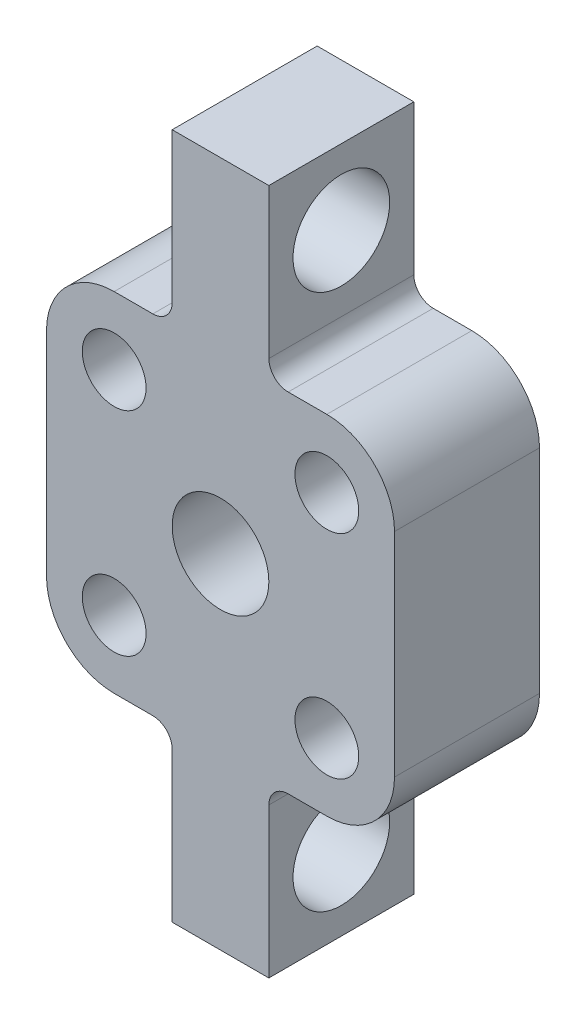
ISO-10303-21;
HEADER;
FILE_DESCRIPTION(('STEP AP214'),'2;1');
FILE_NAME('part.step','',(''),(''),'','','');
FILE_SCHEMA(('AUTOMOTIVE_DESIGN { 1 0 10303 214 1 1 1 1 }'));
ENDSEC;
DATA;
#1=APPLICATION_CONTEXT('core data for automotive mechanical design processes');
#2=APPLICATION_PROTOCOL_DEFINITION('international standard','automotive_design',2000,#1);
#3=PRODUCT_CONTEXT('',#1,'mechanical');
#4=PRODUCT('Part','Part','',(#3));
#5=PRODUCT_RELATED_PRODUCT_CATEGORY('part','',(#4));
#6=PRODUCT_DEFINITION_FORMATION('','',#4);
#7=PRODUCT_DEFINITION_CONTEXT('part definition',#1,'design');
#8=PRODUCT_DEFINITION('design','',#6,#7);
#9=PRODUCT_DEFINITION_SHAPE('','',#8);
#10=(LENGTH_UNIT() NAMED_UNIT(*) SI_UNIT(.MILLI.,.METRE.));
#11=(NAMED_UNIT(*) PLANE_ANGLE_UNIT() SI_UNIT($,.RADIAN.));
#12=(NAMED_UNIT(*) SI_UNIT($,.STERADIAN.) SOLID_ANGLE_UNIT());
#13=UNCERTAINTY_MEASURE_WITH_UNIT(LENGTH_MEASURE(1.E-05),#10,'distance_accuracy_value','');
#14=(GEOMETRIC_REPRESENTATION_CONTEXT(3) GLOBAL_UNCERTAINTY_ASSIGNED_CONTEXT((#13)) GLOBAL_UNIT_ASSIGNED_CONTEXT((#10,
#11,#12)) REPRESENTATION_CONTEXT('',''));
#15=CARTESIAN_POINT('',(0.,0.,0.));
#16=DIRECTION('',(0.,0.,1.));
#17=DIRECTION('',(1.,0.,0.));
#18=AXIS2_PLACEMENT_3D('',#15,#16,#17);
#19=CARTESIAN_POINT('',(6.99999999999999,-20.,15.));
#20=DIRECTION('',(0.,0.,1.));
#21=DIRECTION('',(1.,0.,0.));
#22=AXIS2_PLACEMENT_3D('',#19,#20,#21);
#23=PLANE('',#22);
#24=CARTESIAN_POINT('',(11.,11.,15.));
#25=DIRECTION('',(0.,0.,1.));
#26=DIRECTION('',(1.,0.,0.));
#27=AXIS2_PLACEMENT_3D('',#24,#25,#26);
#28=CIRCLE('',#27,3.29999999999999);
#29=CARTESIAN_POINT('',(14.3,11.,15.));
#30=VERTEX_POINT('',#29);
#31=EDGE_CURVE('E309',#30,#30,#28,.T.);
#32=ORIENTED_EDGE('',*,*,#31,.F.);
#33=EDGE_LOOP('',(#32));
#34=FACE_BOUND('',#33,.T.);
#35=CARTESIAN_POINT('',(-11.,11.,15.));
#36=DIRECTION('',(0.,0.,1.));
#37=DIRECTION('',(1.,0.,0.));
#38=AXIS2_PLACEMENT_3D('',#35,#36,#37);
#39=CIRCLE('',#38,3.29999999999999);
#40=CARTESIAN_POINT('',(-7.70000000000001,11.,15.));
#41=VERTEX_POINT('',#40);
#42=EDGE_CURVE('E316',#41,#41,#39,.T.);
#43=ORIENTED_EDGE('',*,*,#42,.F.);
#44=EDGE_LOOP('',(#43));
#45=FACE_BOUND('',#44,.T.);
#46=CARTESIAN_POINT('',(-11.,-11.,15.));
#47=DIRECTION('',(0.,0.,1.));
#48=DIRECTION('',(1.,0.,0.));
#49=AXIS2_PLACEMENT_3D('',#46,#47,#48);
#50=CIRCLE('',#49,3.29999999999999);
#51=CARTESIAN_POINT('',(-7.70000000000001,-11.,15.));
#52=VERTEX_POINT('',#51);
#53=EDGE_CURVE('E325',#52,#52,#50,.T.);
#54=ORIENTED_EDGE('',*,*,#53,.F.);
#55=EDGE_LOOP('',(#54));
#56=FACE_BOUND('',#55,.T.);
#57=CARTESIAN_POINT('',(11.,-11.,15.));
#58=DIRECTION('',(0.,0.,1.));
#59=DIRECTION('',(1.,0.,0.));
#60=AXIS2_PLACEMENT_3D('',#57,#58,#59);
#61=CIRCLE('',#60,3.29999999999999);
#62=CARTESIAN_POINT('',(14.3,-11.,15.));
#63=VERTEX_POINT('',#62);
#64=EDGE_CURVE('E327',#63,#63,#61,.T.);
#65=ORIENTED_EDGE('',*,*,#64,.F.);
#66=EDGE_LOOP('',(#65));
#67=FACE_BOUND('',#66,.T.);
#68=DIRECTION('',(0.,1.,0.));
#69=VECTOR('',#68,1.);
#70=CARTESIAN_POINT('',(5.00000000000001,-35.5,15.));
#71=LINE('',#70,#69);
#72=CARTESIAN_POINT('',(5.00000000000001,-35.5,15.));
#73=VERTEX_POINT('',#72);
#74=CARTESIAN_POINT('',(4.99999999999999,-20.,15.));
#75=VERTEX_POINT('',#74);
#76=EDGE_CURVE('E246',#73,#75,#71,.T.);
#77=ORIENTED_EDGE('',*,*,#76,.T.);
#78=CARTESIAN_POINT('',(6.99999999999999,-20.,15.));
#79=DIRECTION('',(0.,0.,-1.));
#80=DIRECTION('',(1.,0.,0.));
#81=AXIS2_PLACEMENT_3D('',#78,#79,#80);
#82=CIRCLE('',#81,2.);
#83=CARTESIAN_POINT('',(7.,-18.,15.));
#84=VERTEX_POINT('',#83);
#85=EDGE_CURVE('E139',#75,#84,#82,.T.);
#86=ORIENTED_EDGE('',*,*,#85,.T.);
#87=DIRECTION('',(1.,0.,0.));
#88=VECTOR('',#87,1.);
#89=CARTESIAN_POINT('',(7.,-18.,15.));
#90=LINE('',#89,#88);
#91=CARTESIAN_POINT('',(11.,-18.,15.));
#92=VERTEX_POINT('',#91);
#93=EDGE_CURVE('E342',#84,#92,#90,.T.);
#94=ORIENTED_EDGE('',*,*,#93,.T.);
#95=CARTESIAN_POINT('',(11.,-11.,15.));
#96=DIRECTION('',(0.,0.,1.));
#97=DIRECTION('',(1.,0.,0.));
#98=AXIS2_PLACEMENT_3D('',#95,#96,#97);
#99=CIRCLE('',#98,7.);
#100=CARTESIAN_POINT('',(18.,-11.,15.));
#101=VERTEX_POINT('',#100);
#102=EDGE_CURVE('E345',#92,#101,#99,.T.);
#103=ORIENTED_EDGE('',*,*,#102,.T.);
#104=DIRECTION('',(0.,1.,0.));
#105=VECTOR('',#104,1.);
#106=CARTESIAN_POINT('',(18.,11.,15.));
#107=LINE('',#106,#105);
#108=CARTESIAN_POINT('',(18.,11.,15.));
#109=VERTEX_POINT('',#108);
#110=EDGE_CURVE('E343',#101,#109,#107,.T.);
#111=ORIENTED_EDGE('',*,*,#110,.T.);
#112=CARTESIAN_POINT('',(11.,11.,15.));
#113=DIRECTION('',(0.,0.,1.));
#114=DIRECTION('',(-1.,0.,0.));
#115=AXIS2_PLACEMENT_3D('',#112,#113,#114);
#116=CIRCLE('',#115,7.);
#117=CARTESIAN_POINT('',(11.,18.,15.));
#118=VERTEX_POINT('',#117);
#119=EDGE_CURVE('E350',#109,#118,#116,.T.);
#120=ORIENTED_EDGE('',*,*,#119,.T.);
#121=DIRECTION('',(-1.,0.,0.));
#122=VECTOR('',#121,1.);
#123=CARTESIAN_POINT('',(7.,18.,15.));
#124=LINE('',#123,#122);
#125=CARTESIAN_POINT('',(7.,18.,15.));
#126=VERTEX_POINT('',#125);
#127=EDGE_CURVE('E349',#118,#126,#124,.T.);
#128=ORIENTED_EDGE('',*,*,#127,.T.);
#129=CARTESIAN_POINT('',(6.99999999999999,20.,15.));
#130=DIRECTION('',(0.,0.,-1.));
#131=DIRECTION('',(-1.,0.,0.));
#132=AXIS2_PLACEMENT_3D('',#129,#130,#131);
#133=CIRCLE('',#132,2.);
#134=CARTESIAN_POINT('',(4.99999999999999,20.,15.));
#135=VERTEX_POINT('',#134);
#136=EDGE_CURVE('E351',#126,#135,#133,.T.);
#137=ORIENTED_EDGE('',*,*,#136,.T.);
#138=DIRECTION('',(0.,1.,0.));
#139=VECTOR('',#138,1.);
#140=CARTESIAN_POINT('',(5.00000000000001,35.5,15.));
#141=LINE('',#140,#139);
#142=CARTESIAN_POINT('',(5.00000000000001,35.5,15.));
#143=VERTEX_POINT('',#142);
#144=EDGE_CURVE('E352',#135,#143,#141,.T.);
#145=ORIENTED_EDGE('',*,*,#144,.T.);
#146=DIRECTION('',(-1.,0.,0.));
#147=VECTOR('',#146,1.);
#148=CARTESIAN_POINT('',(-5.00000000000001,35.5,15.));
#149=LINE('',#148,#147);
#150=CARTESIAN_POINT('',(-5.00000000000001,35.5,15.));
#151=VERTEX_POINT('',#150);
#152=EDGE_CURVE('E354',#143,#151,#149,.T.);
#153=ORIENTED_EDGE('',*,*,#152,.T.);
#154=DIRECTION('',(0.,-1.,0.));
#155=VECTOR('',#154,1.);
#156=CARTESIAN_POINT('',(-4.99999999999999,20.,15.));
#157=LINE('',#156,#155);
#158=CARTESIAN_POINT('',(-4.99999999999999,20.,15.));
#159=VERTEX_POINT('',#158);
#160=EDGE_CURVE('E359',#151,#159,#157,.T.);
#161=ORIENTED_EDGE('',*,*,#160,.T.);
#162=CARTESIAN_POINT('',(-6.99999999999999,20.,15.));
#163=DIRECTION('',(0.,0.,-1.));
#164=DIRECTION('',(1.,0.,0.));
#165=AXIS2_PLACEMENT_3D('',#162,#163,#164);
#166=CIRCLE('',#165,2.);
#167=CARTESIAN_POINT('',(-7.,18.,15.));
#168=VERTEX_POINT('',#167);
#169=EDGE_CURVE('E356',#159,#168,#166,.T.);
#170=ORIENTED_EDGE('',*,*,#169,.T.);
#171=DIRECTION('',(-1.,0.,0.));
#172=VECTOR('',#171,1.);
#173=CARTESIAN_POINT('',(-11.,18.,15.));
#174=LINE('',#173,#172);
#175=CARTESIAN_POINT('',(-11.,18.,15.));
#176=VERTEX_POINT('',#175);
#177=EDGE_CURVE('E363',#168,#176,#174,.T.);
#178=ORIENTED_EDGE('',*,*,#177,.T.);
#179=CARTESIAN_POINT('',(-11.,11.,15.));
#180=DIRECTION('',(0.,0.,1.));
#181=DIRECTION('',(1.,0.,0.));
#182=AXIS2_PLACEMENT_3D('',#179,#180,#181);
#183=CIRCLE('',#182,7.);
#184=CARTESIAN_POINT('',(-18.,11.,15.));
#185=VERTEX_POINT('',#184);
#186=EDGE_CURVE('E361',#176,#185,#183,.T.);
#187=ORIENTED_EDGE('',*,*,#186,.T.);
#188=DIRECTION('',(0.,-1.,0.));
#189=VECTOR('',#188,1.);
#190=CARTESIAN_POINT('',(-18.,11.,15.));
#191=LINE('',#190,#189);
#192=CARTESIAN_POINT('',(-18.,-11.,15.));
#193=VERTEX_POINT('',#192);
#194=EDGE_CURVE('E364',#185,#193,#191,.T.);
#195=ORIENTED_EDGE('',*,*,#194,.T.);
#196=CARTESIAN_POINT('',(-11.,-11.,15.));
#197=DIRECTION('',(0.,0.,1.));
#198=DIRECTION('',(-1.,0.,0.));
#199=AXIS2_PLACEMENT_3D('',#196,#197,#198);
#200=CIRCLE('',#199,7.);
#201=CARTESIAN_POINT('',(-11.,-18.,15.));
#202=VERTEX_POINT('',#201);
#203=EDGE_CURVE('E370',#193,#202,#200,.T.);
#204=ORIENTED_EDGE('',*,*,#203,.T.);
#205=DIRECTION('',(1.,0.,0.));
#206=VECTOR('',#205,1.);
#207=CARTESIAN_POINT('',(-11.,-18.,15.));
#208=LINE('',#207,#206);
#209=CARTESIAN_POINT('',(-7.,-18.,15.));
#210=VERTEX_POINT('',#209);
#211=EDGE_CURVE('E194',#202,#210,#208,.T.);
#212=ORIENTED_EDGE('',*,*,#211,.T.);
#213=CARTESIAN_POINT('',(-6.99999999999999,-20.,15.));
#214=DIRECTION('',(0.,0.,-1.));
#215=DIRECTION('',(-1.,0.,0.));
#216=AXIS2_PLACEMENT_3D('',#213,#214,#215);
#217=CIRCLE('',#216,2.);
#218=CARTESIAN_POINT('',(-4.99999999999999,-20.,15.));
#219=VERTEX_POINT('',#218);
#220=EDGE_CURVE('E186',#210,#219,#217,.T.);
#221=ORIENTED_EDGE('',*,*,#220,.T.);
#222=DIRECTION('',(0.,-1.,0.));
#223=VECTOR('',#222,1.);
#224=CARTESIAN_POINT('',(-4.99999999999999,-20.,15.));
#225=LINE('',#224,#223);
#226=CARTESIAN_POINT('',(-4.99999999999999,-35.5,15.));
#227=VERTEX_POINT('',#226);
#228=EDGE_CURVE('E189',#219,#227,#225,.T.);
#229=ORIENTED_EDGE('',*,*,#228,.T.);
#230=DIRECTION('',(1.,0.,0.));
#231=VECTOR('',#230,1.);
#232=CARTESIAN_POINT('',(-4.99999999999999,-35.5,15.));
#233=LINE('',#232,#231);
#234=EDGE_CURVE('E59',#227,#73,#233,.T.);
#235=ORIENTED_EDGE('',*,*,#234,.T.);
#236=EDGE_LOOP('',(#77,#86,#94,#103,#111,#120,#128,#137,#145,#153,#161,#170,#178,#187,#195,#204,
#212,#221,#229,#235));
#237=FACE_BOUND('',#236,.T.);
#238=CARTESIAN_POINT('',(0.,0.,15.));
#239=DIRECTION('',(0.,0.,1.));
#240=DIRECTION('',(1.,0.,0.));
#241=AXIS2_PLACEMENT_3D('',#238,#239,#240);
#242=CIRCLE('',#241,5.);
#243=CARTESIAN_POINT('',(5.,0.,15.));
#244=VERTEX_POINT('',#243);
#245=EDGE_CURVE('E212',#244,#244,#242,.T.);
#246=ORIENTED_EDGE('',*,*,#245,.F.);
#247=EDGE_LOOP('',(#246));
#248=FACE_BOUND('',#247,.T.);
#249=ADVANCED_FACE('F39',(#34,#45,#56,#67,#237,#248),#23,.T.);
#250=CARTESIAN_POINT('',(6.99999999999999,-20.,0.));
#251=DIRECTION('',(0.,0.,1.));
#252=DIRECTION('',(1.,0.,0.));
#253=AXIS2_PLACEMENT_3D('',#250,#251,#252);
#254=PLANE('',#253);
#255=CARTESIAN_POINT('',(11.,11.,0.));
#256=DIRECTION('',(0.,0.,1.));
#257=DIRECTION('',(1.,0.,0.));
#258=AXIS2_PLACEMENT_3D('',#255,#256,#257);
#259=CIRCLE('',#258,3.3);
#260=CARTESIAN_POINT('',(14.3,11.,0.));
#261=VERTEX_POINT('',#260);
#262=EDGE_CURVE('E311',#261,#261,#259,.T.);
#263=ORIENTED_EDGE('',*,*,#262,.T.);
#264=EDGE_LOOP('',(#263));
#265=FACE_BOUND('',#264,.T.);
#266=CARTESIAN_POINT('',(-11.,11.,0.));
#267=DIRECTION('',(0.,0.,1.));
#268=DIRECTION('',(1.,0.,0.));
#269=AXIS2_PLACEMENT_3D('',#266,#267,#268);
#270=CIRCLE('',#269,3.3);
#271=CARTESIAN_POINT('',(-7.7,11.,0.));
#272=VERTEX_POINT('',#271);
#273=EDGE_CURVE('E317',#272,#272,#270,.T.);
#274=ORIENTED_EDGE('',*,*,#273,.T.);
#275=EDGE_LOOP('',(#274));
#276=FACE_BOUND('',#275,.T.);
#277=CARTESIAN_POINT('',(-11.,-11.,0.));
#278=DIRECTION('',(0.,0.,1.));
#279=DIRECTION('',(1.,0.,0.));
#280=AXIS2_PLACEMENT_3D('',#277,#278,#279);
#281=CIRCLE('',#280,3.3);
#282=CARTESIAN_POINT('',(-7.7,-11.,0.));
#283=VERTEX_POINT('',#282);
#284=EDGE_CURVE('E324',#283,#283,#281,.T.);
#285=ORIENTED_EDGE('',*,*,#284,.T.);
#286=EDGE_LOOP('',(#285));
#287=FACE_BOUND('',#286,.T.);
#288=CARTESIAN_POINT('',(11.,-11.,0.));
#289=DIRECTION('',(0.,0.,1.));
#290=DIRECTION('',(1.,0.,0.));
#291=AXIS2_PLACEMENT_3D('',#288,#289,#290);
#292=CIRCLE('',#291,3.3);
#293=CARTESIAN_POINT('',(14.3,-11.,0.));
#294=VERTEX_POINT('',#293);
#295=EDGE_CURVE('E332',#294,#294,#292,.T.);
#296=ORIENTED_EDGE('',*,*,#295,.T.);
#297=EDGE_LOOP('',(#296));
#298=FACE_BOUND('',#297,.T.);
#299=DIRECTION('',(0.,1.,0.));
#300=VECTOR('',#299,1.);
#301=CARTESIAN_POINT('',(5.00000000000001,-35.5,0.));
#302=LINE('',#301,#300);
#303=CARTESIAN_POINT('',(5.00000000000001,-35.5,0.));
#304=VERTEX_POINT('',#303);
#305=CARTESIAN_POINT('',(4.99999999999999,-20.,0.));
#306=VERTEX_POINT('',#305);
#307=EDGE_CURVE('E209',#304,#306,#302,.T.);
#308=ORIENTED_EDGE('',*,*,#307,.F.);
#309=DIRECTION('',(1.,0.,0.));
#310=VECTOR('',#309,1.);
#311=CARTESIAN_POINT('',(-4.99999999999999,-35.5,0.));
#312=LINE('',#311,#310);
#313=CARTESIAN_POINT('',(-4.99999999999999,-35.5,0.));
#314=VERTEX_POINT('',#313);
#315=EDGE_CURVE('E129',#314,#304,#312,.T.);
#316=ORIENTED_EDGE('',*,*,#315,.F.);
#317=DIRECTION('',(0.,-1.,0.));
#318=VECTOR('',#317,1.);
#319=CARTESIAN_POINT('',(-4.99999999999999,-20.,0.));
#320=LINE('',#319,#318);
#321=CARTESIAN_POINT('',(-4.99999999999999,-20.,0.));
#322=VERTEX_POINT('',#321);
#323=EDGE_CURVE('E125',#322,#314,#320,.T.);
#324=ORIENTED_EDGE('',*,*,#323,.F.);
#325=CARTESIAN_POINT('',(-6.99999999999999,-20.,0.));
#326=DIRECTION('',(0.,0.,-1.));
#327=DIRECTION('',(-1.,0.,0.));
#328=AXIS2_PLACEMENT_3D('',#325,#326,#327);
#329=CIRCLE('',#328,2.);
#330=CARTESIAN_POINT('',(-7.,-18.,0.));
#331=VERTEX_POINT('',#330);
#332=EDGE_CURVE('E199',#331,#322,#329,.T.);
#333=ORIENTED_EDGE('',*,*,#332,.F.);
#334=DIRECTION('',(1.,0.,0.));
#335=VECTOR('',#334,1.);
#336=CARTESIAN_POINT('',(-11.,-18.,0.));
#337=LINE('',#336,#335);
#338=CARTESIAN_POINT('',(-11.,-18.,0.));
#339=VERTEX_POINT('',#338);
#340=EDGE_CURVE('E243',#339,#331,#337,.T.);
#341=ORIENTED_EDGE('',*,*,#340,.F.);
#342=CARTESIAN_POINT('',(-11.,-11.,0.));
#343=DIRECTION('',(0.,0.,1.));
#344=DIRECTION('',(-1.,0.,0.));
#345=AXIS2_PLACEMENT_3D('',#342,#343,#344);
#346=CIRCLE('',#345,7.);
#347=CARTESIAN_POINT('',(-18.,-11.,0.));
#348=VERTEX_POINT('',#347);
#349=EDGE_CURVE('E245',#348,#339,#346,.T.);
#350=ORIENTED_EDGE('',*,*,#349,.F.);
#351=DIRECTION('',(0.,-1.,0.));
#352=VECTOR('',#351,1.);
#353=CARTESIAN_POINT('',(-18.,11.,0.));
#354=LINE('',#353,#352);
#355=CARTESIAN_POINT('',(-18.,11.,0.));
#356=VERTEX_POINT('',#355);
#357=EDGE_CURVE('E238',#356,#348,#354,.T.);
#358=ORIENTED_EDGE('',*,*,#357,.F.);
#359=CARTESIAN_POINT('',(-11.,11.,0.));
#360=DIRECTION('',(0.,0.,1.));
#361=DIRECTION('',(1.,0.,0.));
#362=AXIS2_PLACEMENT_3D('',#359,#360,#361);
#363=CIRCLE('',#362,7.);
#364=CARTESIAN_POINT('',(-11.,18.,0.));
#365=VERTEX_POINT('',#364);
#366=EDGE_CURVE('E236',#365,#356,#363,.T.);
#367=ORIENTED_EDGE('',*,*,#366,.F.);
#368=DIRECTION('',(-1.,0.,0.));
#369=VECTOR('',#368,1.);
#370=CARTESIAN_POINT('',(-11.,18.,0.));
#371=LINE('',#370,#369);
#372=CARTESIAN_POINT('',(-7.,18.,0.));
#373=VERTEX_POINT('',#372);
#374=EDGE_CURVE('E237',#373,#365,#371,.T.);
#375=ORIENTED_EDGE('',*,*,#374,.F.);
#376=CARTESIAN_POINT('',(-6.99999999999999,20.,0.));
#377=DIRECTION('',(0.,0.,-1.));
#378=DIRECTION('',(1.,0.,0.));
#379=AXIS2_PLACEMENT_3D('',#376,#377,#378);
#380=CIRCLE('',#379,2.);
#381=CARTESIAN_POINT('',(-4.99999999999999,20.,0.));
#382=VERTEX_POINT('',#381);
#383=EDGE_CURVE('E231',#382,#373,#380,.T.);
#384=ORIENTED_EDGE('',*,*,#383,.F.);
#385=DIRECTION('',(0.,-1.,0.));
#386=VECTOR('',#385,1.);
#387=CARTESIAN_POINT('',(-4.99999999999999,20.,0.));
#388=LINE('',#387,#386);
#389=CARTESIAN_POINT('',(-5.00000000000001,35.5,0.));
#390=VERTEX_POINT('',#389);
#391=EDGE_CURVE('E234',#390,#382,#388,.T.);
#392=ORIENTED_EDGE('',*,*,#391,.F.);
#393=DIRECTION('',(-1.,0.,0.));
#394=VECTOR('',#393,1.);
#395=CARTESIAN_POINT('',(-5.00000000000001,35.5,0.));
#396=LINE('',#395,#394);
#397=CARTESIAN_POINT('',(5.00000000000001,35.5,0.));
#398=VERTEX_POINT('',#397);
#399=EDGE_CURVE('E229',#398,#390,#396,.T.);
#400=ORIENTED_EDGE('',*,*,#399,.F.);
#401=DIRECTION('',(0.,1.,0.));
#402=VECTOR('',#401,1.);
#403=CARTESIAN_POINT('',(5.00000000000001,35.5,0.));
#404=LINE('',#403,#402);
#405=CARTESIAN_POINT('',(4.99999999999999,20.,0.));
#406=VERTEX_POINT('',#405);
#407=EDGE_CURVE('E227',#406,#398,#404,.T.);
#408=ORIENTED_EDGE('',*,*,#407,.F.);
#409=CARTESIAN_POINT('',(6.99999999999999,20.,0.));
#410=DIRECTION('',(0.,0.,-1.));
#411=DIRECTION('',(-1.,0.,0.));
#412=AXIS2_PLACEMENT_3D('',#409,#410,#411);
#413=CIRCLE('',#412,2.);
#414=CARTESIAN_POINT('',(7.,18.,0.));
#415=VERTEX_POINT('',#414);
#416=EDGE_CURVE('E226',#415,#406,#413,.T.);
#417=ORIENTED_EDGE('',*,*,#416,.F.);
#418=DIRECTION('',(-1.,0.,0.));
#419=VECTOR('',#418,1.);
#420=CARTESIAN_POINT('',(7.,18.,0.));
#421=LINE('',#420,#419);
#422=CARTESIAN_POINT('',(11.,18.,0.));
#423=VERTEX_POINT('',#422);
#424=EDGE_CURVE('E221',#423,#415,#421,.T.);
#425=ORIENTED_EDGE('',*,*,#424,.F.);
#426=CARTESIAN_POINT('',(11.,11.,0.));
#427=DIRECTION('',(0.,0.,1.));
#428=DIRECTION('',(-1.,0.,0.));
#429=AXIS2_PLACEMENT_3D('',#426,#427,#428);
#430=CIRCLE('',#429,7.);
#431=CARTESIAN_POINT('',(18.,11.,0.));
#432=VERTEX_POINT('',#431);
#433=EDGE_CURVE('E225',#432,#423,#430,.T.);
#434=ORIENTED_EDGE('',*,*,#433,.F.);
#435=DIRECTION('',(0.,1.,0.));
#436=VECTOR('',#435,1.);
#437=CARTESIAN_POINT('',(18.,11.,0.));
#438=LINE('',#437,#436);
#439=CARTESIAN_POINT('',(18.,-11.,0.));
#440=VERTEX_POINT('',#439);
#441=EDGE_CURVE('E219',#440,#432,#438,.T.);
#442=ORIENTED_EDGE('',*,*,#441,.F.);
#443=CARTESIAN_POINT('',(11.,-11.,0.));
#444=DIRECTION('',(0.,0.,1.));
#445=DIRECTION('',(1.,0.,0.));
#446=AXIS2_PLACEMENT_3D('',#443,#444,#445);
#447=CIRCLE('',#446,7.);
#448=CARTESIAN_POINT('',(11.,-18.,0.));
#449=VERTEX_POINT('',#448);
#450=EDGE_CURVE('E217',#449,#440,#447,.T.);
#451=ORIENTED_EDGE('',*,*,#450,.F.);
#452=DIRECTION('',(1.,0.,0.));
#453=VECTOR('',#452,1.);
#454=CARTESIAN_POINT('',(7.,-18.,0.));
#455=LINE('',#454,#453);
#456=CARTESIAN_POINT('',(7.,-18.,0.));
#457=VERTEX_POINT('',#456);
#458=EDGE_CURVE('E216',#457,#449,#455,.T.);
#459=ORIENTED_EDGE('',*,*,#458,.F.);
#460=CARTESIAN_POINT('',(6.99999999999999,-20.,0.));
#461=DIRECTION('',(0.,0.,-1.));
#462=DIRECTION('',(1.,0.,0.));
#463=AXIS2_PLACEMENT_3D('',#460,#461,#462);
#464=CIRCLE('',#463,2.);
#465=EDGE_CURVE('E213',#306,#457,#464,.T.);
#466=ORIENTED_EDGE('',*,*,#465,.F.);
#467=EDGE_LOOP('',(#308,#316,#324,#333,#341,#350,#358,#367,#375,#384,#392,#400,#408,#417,#425,
#434,#442,#451,#459,#466));
#468=FACE_BOUND('',#467,.T.);
#469=CARTESIAN_POINT('',(0.,0.,0.));
#470=DIRECTION('',(0.,0.,1.));
#471=DIRECTION('',(1.,0.,0.));
#472=AXIS2_PLACEMENT_3D('',#469,#470,#471);
#473=CIRCLE('',#472,5.);
#474=CARTESIAN_POINT('',(5.,0.,0.));
#475=VERTEX_POINT('',#474);
#476=EDGE_CURVE('E331',#475,#475,#473,.T.);
#477=ORIENTED_EDGE('',*,*,#476,.T.);
#478=EDGE_LOOP('',(#477));
#479=FACE_BOUND('',#478,.T.);
#480=ADVANCED_FACE('F379',(#265,#276,#287,#298,#468,#479),#254,.F.);
#481=CARTESIAN_POINT('',(5.00000000000001,-35.5,15.));
#482=DIRECTION('',(-1.,0.,0.));
#483=DIRECTION('',(0.,-1.,0.));
#484=AXIS2_PLACEMENT_3D('',#481,#482,#483);
#485=PLANE('',#484);
#486=CARTESIAN_POINT('',(5.,-27.75,7.49999999999999));
#487=DIRECTION('',(-1.,0.,0.));
#488=DIRECTION('',(0.,-1.,0.));
#489=AXIS2_PLACEMENT_3D('',#486,#487,#488);
#490=CIRCLE('',#489,5.);
#491=CARTESIAN_POINT('',(5.00000000000001,-32.75,7.49999999999999));
#492=VERTEX_POINT('',#491);
#493=EDGE_CURVE('E297',#492,#492,#490,.F.);
#494=ORIENTED_EDGE('',*,*,#493,.F.);
#495=EDGE_LOOP('',(#494));
#496=FACE_BOUND('',#495,.T.);
#497=ORIENTED_EDGE('',*,*,#307,.T.);
#498=DIRECTION('',(0.,0.,-1.));
#499=VECTOR('',#498,1.);
#500=CARTESIAN_POINT('',(4.99999999999999,-20.,15.));
#501=LINE('',#500,#499);
#502=EDGE_CURVE('E11',#75,#306,#501,.T.);
#503=ORIENTED_EDGE('',*,*,#502,.F.);
#504=ORIENTED_EDGE('',*,*,#76,.F.);
#505=DIRECTION('',(0.,0.,-1.));
#506=VECTOR('',#505,1.);
#507=CARTESIAN_POINT('',(5.00000000000001,-35.5,15.));
#508=LINE('',#507,#506);
#509=EDGE_CURVE('E206',#73,#304,#508,.T.);
#510=ORIENTED_EDGE('',*,*,#509,.T.);
#511=EDGE_LOOP('',(#497,#503,#504,#510));
#512=FACE_BOUND('',#511,.T.);
#513=ADVANCED_FACE('F41',(#496,#512),#485,.F.);
#514=CARTESIAN_POINT('',(6.99999999999999,-20.,15.));
#515=DIRECTION('',(0.,0.,-1.));
#516=DIRECTION('',(-1.,0.,0.));
#517=AXIS2_PLACEMENT_3D('',#514,#515,#516);
#518=CYLINDRICAL_SURFACE('',#517,2.);
#519=ORIENTED_EDGE('',*,*,#465,.T.);
#520=DIRECTION('',(0.,0.,-1.));
#521=VECTOR('',#520,1.);
#522=CARTESIAN_POINT('',(7.,-18.,15.));
#523=LINE('',#522,#521);
#524=EDGE_CURVE('E47',#84,#457,#523,.T.);
#525=ORIENTED_EDGE('',*,*,#524,.F.);
#526=ORIENTED_EDGE('',*,*,#85,.F.);
#527=ORIENTED_EDGE('',*,*,#502,.T.);
#528=EDGE_LOOP('',(#519,#525,#526,#527));
#529=FACE_BOUND('',#528,.T.);
#530=ADVANCED_FACE('F495',(#529),#518,.F.);
#531=CARTESIAN_POINT('',(7.,-18.,15.));
#532=DIRECTION('',(0.,1.,0.));
#533=DIRECTION('',(-1.,0.,0.));
#534=AXIS2_PLACEMENT_3D('',#531,#532,#533);
#535=PLANE('',#534);
#536=ORIENTED_EDGE('',*,*,#458,.T.);
#537=DIRECTION('',(0.,0.,-1.));
#538=VECTOR('',#537,1.);
#539=CARTESIAN_POINT('',(11.,-18.,15.));
#540=LINE('',#539,#538);
#541=EDGE_CURVE('E295',#92,#449,#540,.T.);
#542=ORIENTED_EDGE('',*,*,#541,.F.);
#543=ORIENTED_EDGE('',*,*,#93,.F.);
#544=ORIENTED_EDGE('',*,*,#524,.T.);
#545=EDGE_LOOP('',(#536,#542,#543,#544));
#546=FACE_BOUND('',#545,.T.);
#547=ADVANCED_FACE('F491',(#546),#535,.F.);
#548=CARTESIAN_POINT('',(11.,-11.,15.));
#549=DIRECTION('',(0.,0.,-1.));
#550=DIRECTION('',(-1.,0.,0.));
#551=AXIS2_PLACEMENT_3D('',#548,#549,#550);
#552=CYLINDRICAL_SURFACE('',#551,7.);
#553=ORIENTED_EDGE('',*,*,#450,.T.);
#554=DIRECTION('',(0.,0.,-1.));
#555=VECTOR('',#554,1.);
#556=CARTESIAN_POINT('',(18.,-11.,15.));
#557=LINE('',#556,#555);
#558=EDGE_CURVE('E286',#101,#440,#557,.T.);
#559=ORIENTED_EDGE('',*,*,#558,.F.);
#560=ORIENTED_EDGE('',*,*,#102,.F.);
#561=ORIENTED_EDGE('',*,*,#541,.T.);
#562=EDGE_LOOP('',(#553,#559,#560,#561));
#563=FACE_BOUND('',#562,.T.);
#564=ADVANCED_FACE('F486',(#563),#552,.T.);
#565=CARTESIAN_POINT('',(18.,11.,15.));
#566=DIRECTION('',(-1.,0.,0.));
#567=DIRECTION('',(0.,-1.,0.));
#568=AXIS2_PLACEMENT_3D('',#565,#566,#567);
#569=PLANE('',#568);
#570=ORIENTED_EDGE('',*,*,#441,.T.);
#571=DIRECTION('',(0.,0.,-1.));
#572=VECTOR('',#571,1.);
#573=CARTESIAN_POINT('',(18.,11.,15.));
#574=LINE('',#573,#572);
#575=EDGE_CURVE('E287',#109,#432,#574,.T.);
#576=ORIENTED_EDGE('',*,*,#575,.F.);
#577=ORIENTED_EDGE('',*,*,#110,.F.);
#578=ORIENTED_EDGE('',*,*,#558,.T.);
#579=EDGE_LOOP('',(#570,#576,#577,#578));
#580=FACE_BOUND('',#579,.T.);
#581=ADVANCED_FACE('F485',(#580),#569,.F.);
#582=CARTESIAN_POINT('',(11.,11.,15.));
#583=DIRECTION('',(0.,0.,-1.));
#584=DIRECTION('',(-1.,0.,0.));
#585=AXIS2_PLACEMENT_3D('',#582,#583,#584);
#586=CYLINDRICAL_SURFACE('',#585,7.);
#587=ORIENTED_EDGE('',*,*,#433,.T.);
#588=DIRECTION('',(0.,0.,-1.));
#589=VECTOR('',#588,1.);
#590=CARTESIAN_POINT('',(11.,18.,15.));
#591=LINE('',#590,#589);
#592=EDGE_CURVE('E282',#118,#423,#591,.T.);
#593=ORIENTED_EDGE('',*,*,#592,.F.);
#594=ORIENTED_EDGE('',*,*,#119,.F.);
#595=ORIENTED_EDGE('',*,*,#575,.T.);
#596=EDGE_LOOP('',(#587,#593,#594,#595));
#597=FACE_BOUND('',#596,.T.);
#598=ADVANCED_FACE('F476',(#597),#586,.T.);
#599=CARTESIAN_POINT('',(7.,18.,15.));
#600=DIRECTION('',(0.,-1.,0.));
#601=DIRECTION('',(1.,0.,0.));
#602=AXIS2_PLACEMENT_3D('',#599,#600,#601);
#603=PLANE('',#602);
#604=ORIENTED_EDGE('',*,*,#424,.T.);
#605=DIRECTION('',(0.,0.,-1.));
#606=VECTOR('',#605,1.);
#607=CARTESIAN_POINT('',(7.,18.,15.));
#608=LINE('',#607,#606);
#609=EDGE_CURVE('E278',#126,#415,#608,.T.);
#610=ORIENTED_EDGE('',*,*,#609,.F.);
#611=ORIENTED_EDGE('',*,*,#127,.F.);
#612=ORIENTED_EDGE('',*,*,#592,.T.);
#613=EDGE_LOOP('',(#604,#610,#611,#612));
#614=FACE_BOUND('',#613,.T.);
#615=ADVANCED_FACE('F475',(#614),#603,.F.);
#616=CARTESIAN_POINT('',(6.99999999999999,20.,15.));
#617=DIRECTION('',(0.,0.,-1.));
#618=DIRECTION('',(-1.,0.,0.));
#619=AXIS2_PLACEMENT_3D('',#616,#617,#618);
#620=CYLINDRICAL_SURFACE('',#619,2.);
#621=ORIENTED_EDGE('',*,*,#416,.T.);
#622=DIRECTION('',(0.,0.,-1.));
#623=VECTOR('',#622,1.);
#624=CARTESIAN_POINT('',(4.99999999999999,20.,15.));
#625=LINE('',#624,#623);
#626=EDGE_CURVE('E280',#135,#406,#625,.T.);
#627=ORIENTED_EDGE('',*,*,#626,.F.);
#628=ORIENTED_EDGE('',*,*,#136,.F.);
#629=ORIENTED_EDGE('',*,*,#609,.T.);
#630=EDGE_LOOP('',(#621,#627,#628,#629));
#631=FACE_BOUND('',#630,.T.);
#632=ADVANCED_FACE('F445',(#631),#620,.F.);
#633=CARTESIAN_POINT('',(5.00000000000001,35.5,15.));
#634=DIRECTION('',(-1.,0.,0.));
#635=DIRECTION('',(0.,-1.,0.));
#636=AXIS2_PLACEMENT_3D('',#633,#634,#635);
#637=PLANE('',#636);
#638=CARTESIAN_POINT('',(5.,27.75,7.5));
#639=DIRECTION('',(-1.,0.,0.));
#640=DIRECTION('',(0.,-1.,0.));
#641=AXIS2_PLACEMENT_3D('',#638,#639,#640);
#642=CIRCLE('',#641,5.);
#643=CARTESIAN_POINT('',(5.,22.75,7.5));
#644=VERTEX_POINT('',#643);
#645=EDGE_CURVE('E308',#644,#644,#642,.F.);
#646=ORIENTED_EDGE('',*,*,#645,.F.);
#647=EDGE_LOOP('',(#646));
#648=FACE_BOUND('',#647,.T.);
#649=ORIENTED_EDGE('',*,*,#407,.T.);
#650=DIRECTION('',(0.,0.,-1.));
#651=VECTOR('',#650,1.);
#652=CARTESIAN_POINT('',(5.00000000000001,35.5,15.));
#653=LINE('',#652,#651);
#654=EDGE_CURVE('E273',#143,#398,#653,.T.);
#655=ORIENTED_EDGE('',*,*,#654,.F.);
#656=ORIENTED_EDGE('',*,*,#144,.F.);
#657=ORIENTED_EDGE('',*,*,#626,.T.);
#658=EDGE_LOOP('',(#649,#655,#656,#657));
#659=FACE_BOUND('',#658,.T.);
#660=ADVANCED_FACE('F437',(#648,#659),#637,.F.);
#661=CARTESIAN_POINT('',(-5.00000000000001,35.5,15.));
#662=DIRECTION('',(0.,-1.,0.));
#663=DIRECTION('',(0.,0.,-1.));
#664=AXIS2_PLACEMENT_3D('',#661,#662,#663);
#665=PLANE('',#664);
#666=ORIENTED_EDGE('',*,*,#399,.T.);
#667=DIRECTION('',(0.,0.,-1.));
#668=VECTOR('',#667,1.);
#669=CARTESIAN_POINT('',(-5.00000000000001,35.5,15.));
#670=LINE('',#669,#668);
#671=EDGE_CURVE('E271',#151,#390,#670,.T.);
#672=ORIENTED_EDGE('',*,*,#671,.F.);
#673=ORIENTED_EDGE('',*,*,#152,.F.);
#674=ORIENTED_EDGE('',*,*,#654,.T.);
#675=EDGE_LOOP('',(#666,#672,#673,#674));
#676=FACE_BOUND('',#675,.T.);
#677=ADVANCED_FACE('F442',(#676),#665,.F.);
#678=CARTESIAN_POINT('',(-4.99999999999999,20.,15.));
#679=DIRECTION('',(1.,0.,0.));
#680=DIRECTION('',(0.,1.,0.));
#681=AXIS2_PLACEMENT_3D('',#678,#679,#680);
#682=PLANE('',#681);
#683=CARTESIAN_POINT('',(-5.,27.75,7.5));
#684=DIRECTION('',(1.,0.,0.));
#685=DIRECTION('',(0.,1.,0.));
#686=AXIS2_PLACEMENT_3D('',#683,#684,#685);
#687=CIRCLE('',#686,5.);
#688=CARTESIAN_POINT('',(-5.00000000000001,32.75,7.5));
#689=VERTEX_POINT('',#688);
#690=EDGE_CURVE('E43',#689,#689,#687,.F.);
#691=ORIENTED_EDGE('',*,*,#690,.F.);
#692=EDGE_LOOP('',(#691));
#693=FACE_BOUND('',#692,.T.);
#694=ORIENTED_EDGE('',*,*,#391,.T.);
#695=DIRECTION('',(0.,0.,-1.));
#696=VECTOR('',#695,1.);
#697=CARTESIAN_POINT('',(-4.99999999999999,20.,15.));
#698=LINE('',#697,#696);
#699=EDGE_CURVE('E268',#159,#382,#698,.T.);
#700=ORIENTED_EDGE('',*,*,#699,.F.);
#701=ORIENTED_EDGE('',*,*,#160,.F.);
#702=ORIENTED_EDGE('',*,*,#671,.T.);
#703=EDGE_LOOP('',(#694,#700,#701,#702));
#704=FACE_BOUND('',#703,.T.);
#705=ADVANCED_FACE('F456',(#693,#704),#682,.F.);
#706=CARTESIAN_POINT('',(-6.99999999999999,20.,15.));
#707=DIRECTION('',(0.,0.,-1.));
#708=DIRECTION('',(-1.,0.,0.));
#709=AXIS2_PLACEMENT_3D('',#706,#707,#708);
#710=CYLINDRICAL_SURFACE('',#709,2.);
#711=ORIENTED_EDGE('',*,*,#383,.T.);
#712=DIRECTION('',(0.,0.,-1.));
#713=VECTOR('',#712,1.);
#714=CARTESIAN_POINT('',(-7.,18.,15.));
#715=LINE('',#714,#713);
#716=EDGE_CURVE('E264',#168,#373,#715,.T.);
#717=ORIENTED_EDGE('',*,*,#716,.F.);
#718=ORIENTED_EDGE('',*,*,#169,.F.);
#719=ORIENTED_EDGE('',*,*,#699,.T.);
#720=EDGE_LOOP('',(#711,#717,#718,#719));
#721=FACE_BOUND('',#720,.T.);
#722=ADVANCED_FACE('F465',(#721),#710,.F.);
#723=CARTESIAN_POINT('',(-11.,18.,15.));
#724=DIRECTION('',(0.,-1.,0.));
#725=DIRECTION('',(0.,0.,-1.));
#726=AXIS2_PLACEMENT_3D('',#723,#724,#725);
#727=PLANE('',#726);
#728=ORIENTED_EDGE('',*,*,#374,.T.);
#729=DIRECTION('',(0.,0.,-1.));
#730=VECTOR('',#729,1.);
#731=CARTESIAN_POINT('',(-11.,18.,15.));
#732=LINE('',#731,#730);
#733=EDGE_CURVE('E265',#176,#365,#732,.T.);
#734=ORIENTED_EDGE('',*,*,#733,.F.);
#735=ORIENTED_EDGE('',*,*,#177,.F.);
#736=ORIENTED_EDGE('',*,*,#716,.T.);
#737=EDGE_LOOP('',(#728,#734,#735,#736));
#738=FACE_BOUND('',#737,.T.);
#739=ADVANCED_FACE('F517',(#738),#727,.F.);
#740=CARTESIAN_POINT('',(-11.,11.,15.));
#741=DIRECTION('',(0.,0.,-1.));
#742=DIRECTION('',(-1.,0.,0.));
#743=AXIS2_PLACEMENT_3D('',#740,#741,#742);
#744=CYLINDRICAL_SURFACE('',#743,7.);
#745=ORIENTED_EDGE('',*,*,#366,.T.);
#746=DIRECTION('',(0.,0.,-1.));
#747=VECTOR('',#746,1.);
#748=CARTESIAN_POINT('',(-18.,11.,15.));
#749=LINE('',#748,#747);
#750=EDGE_CURVE('E259',#185,#356,#749,.T.);
#751=ORIENTED_EDGE('',*,*,#750,.F.);
#752=ORIENTED_EDGE('',*,*,#186,.F.);
#753=ORIENTED_EDGE('',*,*,#733,.T.);
#754=EDGE_LOOP('',(#745,#751,#752,#753));
#755=FACE_BOUND('',#754,.T.);
#756=ADVANCED_FACE('F522',(#755),#744,.T.);
#757=CARTESIAN_POINT('',(-18.,11.,15.));
#758=DIRECTION('',(1.,0.,0.));
#759=DIRECTION('',(0.,0.,-1.));
#760=AXIS2_PLACEMENT_3D('',#757,#758,#759);
#761=PLANE('',#760);
#762=ORIENTED_EDGE('',*,*,#357,.T.);
#763=DIRECTION('',(0.,0.,-1.));
#764=VECTOR('',#763,1.);
#765=CARTESIAN_POINT('',(-18.,-11.,15.));
#766=LINE('',#765,#764);
#767=EDGE_CURVE('E258',#193,#348,#766,.T.);
#768=ORIENTED_EDGE('',*,*,#767,.F.);
#769=ORIENTED_EDGE('',*,*,#194,.F.);
#770=ORIENTED_EDGE('',*,*,#750,.T.);
#771=EDGE_LOOP('',(#762,#768,#769,#770));
#772=FACE_BOUND('',#771,.T.);
#773=ADVANCED_FACE('F523',(#772),#761,.F.);
#774=CARTESIAN_POINT('',(-11.,-11.,15.));
#775=DIRECTION('',(0.,0.,-1.));
#776=DIRECTION('',(-1.,0.,0.));
#777=AXIS2_PLACEMENT_3D('',#774,#775,#776);
#778=CYLINDRICAL_SURFACE('',#777,7.);
#779=ORIENTED_EDGE('',*,*,#349,.T.);
#780=DIRECTION('',(0.,0.,-1.));
#781=VECTOR('',#780,1.);
#782=CARTESIAN_POINT('',(-11.,-18.,15.));
#783=LINE('',#782,#781);
#784=EDGE_CURVE('E251',#202,#339,#783,.T.);
#785=ORIENTED_EDGE('',*,*,#784,.F.);
#786=ORIENTED_EDGE('',*,*,#203,.F.);
#787=ORIENTED_EDGE('',*,*,#767,.T.);
#788=EDGE_LOOP('',(#779,#785,#786,#787));
#789=FACE_BOUND('',#788,.T.);
#790=ADVANCED_FACE('F373',(#789),#778,.T.);
#791=CARTESIAN_POINT('',(-11.,-18.,15.));
#792=DIRECTION('',(0.,1.,0.));
#793=DIRECTION('',(0.,0.,1.));
#794=AXIS2_PLACEMENT_3D('',#791,#792,#793);
#795=PLANE('',#794);
#796=ORIENTED_EDGE('',*,*,#340,.T.);
#797=DIRECTION('',(0.,0.,-1.));
#798=VECTOR('',#797,1.);
#799=CARTESIAN_POINT('',(-7.,-18.,15.));
#800=LINE('',#799,#798);
#801=EDGE_CURVE('E203',#210,#331,#800,.T.);
#802=ORIENTED_EDGE('',*,*,#801,.F.);
#803=ORIENTED_EDGE('',*,*,#211,.F.);
#804=ORIENTED_EDGE('',*,*,#784,.T.);
#805=EDGE_LOOP('',(#796,#802,#803,#804));
#806=FACE_BOUND('',#805,.T.);
#807=ADVANCED_FACE('F380',(#806),#795,.F.);
#808=CARTESIAN_POINT('',(-6.99999999999999,-20.,15.));
#809=DIRECTION('',(0.,0.,-1.));
#810=DIRECTION('',(-1.,0.,0.));
#811=AXIS2_PLACEMENT_3D('',#808,#809,#810);
#812=CYLINDRICAL_SURFACE('',#811,2.);
#813=ORIENTED_EDGE('',*,*,#332,.T.);
#814=DIRECTION('',(0.,0.,-1.));
#815=VECTOR('',#814,1.);
#816=CARTESIAN_POINT('',(-4.99999999999999,-20.,15.));
#817=LINE('',#816,#815);
#818=EDGE_CURVE('E197',#219,#322,#817,.T.);
#819=ORIENTED_EDGE('',*,*,#818,.F.);
#820=ORIENTED_EDGE('',*,*,#220,.F.);
#821=ORIENTED_EDGE('',*,*,#801,.T.);
#822=EDGE_LOOP('',(#813,#819,#820,#821));
#823=FACE_BOUND('',#822,.T.);
#824=ADVANCED_FACE('F196',(#823),#812,.F.);
#825=CARTESIAN_POINT('',(-4.99999999999999,-20.,15.));
#826=DIRECTION('',(1.,0.,0.));
#827=DIRECTION('',(0.,1.,0.));
#828=AXIS2_PLACEMENT_3D('',#825,#826,#827);
#829=PLANE('',#828);
#830=CARTESIAN_POINT('',(-4.99999999999999,-27.75,7.49999999999999));
#831=DIRECTION('',(1.,0.,0.));
#832=DIRECTION('',(0.,1.,0.));
#833=AXIS2_PLACEMENT_3D('',#830,#831,#832);
#834=CIRCLE('',#833,5.);
#835=CARTESIAN_POINT('',(-4.99999999999999,-22.75,7.49999999999999));
#836=VERTEX_POINT('',#835);
#837=EDGE_CURVE('E296',#836,#836,#834,.F.);
#838=ORIENTED_EDGE('',*,*,#837,.F.);
#839=EDGE_LOOP('',(#838));
#840=FACE_BOUND('',#839,.T.);
#841=ORIENTED_EDGE('',*,*,#323,.T.);
#842=DIRECTION('',(0.,0.,-1.));
#843=VECTOR('',#842,1.);
#844=CARTESIAN_POINT('',(-4.99999999999999,-35.5,15.));
#845=LINE('',#844,#843);
#846=EDGE_CURVE('E205',#227,#314,#845,.T.);
#847=ORIENTED_EDGE('',*,*,#846,.F.);
#848=ORIENTED_EDGE('',*,*,#228,.F.);
#849=ORIENTED_EDGE('',*,*,#818,.T.);
#850=EDGE_LOOP('',(#841,#847,#848,#849));
#851=FACE_BOUND('',#850,.T.);
#852=ADVANCED_FACE('F204',(#840,#851),#829,.F.);
#853=CARTESIAN_POINT('',(-4.99999999999999,-35.5,15.));
#854=DIRECTION('',(0.,1.,0.));
#855=DIRECTION('',(0.,0.,1.));
#856=AXIS2_PLACEMENT_3D('',#853,#854,#855);
#857=PLANE('',#856);
#858=ORIENTED_EDGE('',*,*,#315,.T.);
#859=ORIENTED_EDGE('',*,*,#509,.F.);
#860=ORIENTED_EDGE('',*,*,#234,.F.);
#861=ORIENTED_EDGE('',*,*,#846,.T.);
#862=EDGE_LOOP('',(#858,#859,#860,#861));
#863=FACE_BOUND('',#862,.T.);
#864=ADVANCED_FACE('F387',(#863),#857,.F.);
#865=CARTESIAN_POINT('',(0.,0.,15.));
#866=DIRECTION('',(0.,0.,-1.));
#867=DIRECTION('',(-1.,0.,0.));
#868=AXIS2_PLACEMENT_3D('',#865,#866,#867);
#869=CYLINDRICAL_SURFACE('',#868,5.);
#870=ORIENTED_EDGE('',*,*,#245,.T.);
#871=EDGE_LOOP('',(#870));
#872=FACE_BOUND('',#871,.T.);
#873=ORIENTED_EDGE('',*,*,#476,.F.);
#874=EDGE_LOOP('',(#873));
#875=FACE_BOUND('',#874,.T.);
#876=ADVANCED_FACE('F389',(#872,#875),#869,.F.);
#877=CARTESIAN_POINT('',(11.,-11.,15.));
#878=DIRECTION('',(0.,0.,1.));
#879=DIRECTION('',(1.,0.,0.));
#880=AXIS2_PLACEMENT_3D('',#877,#878,#879);
#881=CYLINDRICAL_SURFACE('',#880,3.29999999999999);
#882=ORIENTED_EDGE('',*,*,#295,.F.);
#883=EDGE_LOOP('',(#882));
#884=FACE_BOUND('',#883,.T.);
#885=ORIENTED_EDGE('',*,*,#64,.T.);
#886=EDGE_LOOP('',(#885));
#887=FACE_BOUND('',#886,.T.);
#888=ADVANCED_FACE('F393',(#884,#887),#881,.F.);
#889=CARTESIAN_POINT('',(-11.,-11.,15.));
#890=DIRECTION('',(0.,0.,1.));
#891=DIRECTION('',(1.,0.,0.));
#892=AXIS2_PLACEMENT_3D('',#889,#890,#891);
#893=CYLINDRICAL_SURFACE('',#892,3.29999999999999);
#894=ORIENTED_EDGE('',*,*,#284,.F.);
#895=EDGE_LOOP('',(#894));
#896=FACE_BOUND('',#895,.T.);
#897=ORIENTED_EDGE('',*,*,#53,.T.);
#898=EDGE_LOOP('',(#897));
#899=FACE_BOUND('',#898,.T.);
#900=ADVANCED_FACE('F415',(#896,#899),#893,.F.);
#901=CARTESIAN_POINT('',(-11.,11.,15.));
#902=DIRECTION('',(0.,0.,1.));
#903=DIRECTION('',(1.,0.,0.));
#904=AXIS2_PLACEMENT_3D('',#901,#902,#903);
#905=CYLINDRICAL_SURFACE('',#904,3.29999999999999);
#906=ORIENTED_EDGE('',*,*,#273,.F.);
#907=EDGE_LOOP('',(#906));
#908=FACE_BOUND('',#907,.T.);
#909=ORIENTED_EDGE('',*,*,#42,.T.);
#910=EDGE_LOOP('',(#909));
#911=FACE_BOUND('',#910,.T.);
#912=ADVANCED_FACE('F417',(#908,#911),#905,.F.);
#913=CARTESIAN_POINT('',(11.,11.,15.));
#914=DIRECTION('',(0.,0.,1.));
#915=DIRECTION('',(1.,0.,0.));
#916=AXIS2_PLACEMENT_3D('',#913,#914,#915);
#917=CYLINDRICAL_SURFACE('',#916,3.29999999999999);
#918=ORIENTED_EDGE('',*,*,#262,.F.);
#919=EDGE_LOOP('',(#918));
#920=FACE_BOUND('',#919,.T.);
#921=ORIENTED_EDGE('',*,*,#31,.T.);
#922=EDGE_LOOP('',(#921));
#923=FACE_BOUND('',#922,.T.);
#924=ADVANCED_FACE('F423',(#920,#923),#917,.F.);
#925=CARTESIAN_POINT('',(18.,-27.75,7.49999999999999));
#926=DIRECTION('',(-1.,0.,0.));
#927=DIRECTION('',(0.,0.,1.));
#928=AXIS2_PLACEMENT_3D('',#925,#926,#927);
#929=CYLINDRICAL_SURFACE('',#928,5.);
#930=ORIENTED_EDGE('',*,*,#837,.T.);
#931=EDGE_LOOP('',(#930));
#932=FACE_BOUND('',#931,.T.);
#933=ORIENTED_EDGE('',*,*,#493,.T.);
#934=EDGE_LOOP('',(#933));
#935=FACE_BOUND('',#934,.T.);
#936=ADVANCED_FACE('F422',(#932,#935),#929,.F.);
#937=CARTESIAN_POINT('',(18.,27.75,7.5));
#938=DIRECTION('',(-1.,0.,0.));
#939=DIRECTION('',(0.,0.,1.));
#940=AXIS2_PLACEMENT_3D('',#937,#938,#939);
#941=CYLINDRICAL_SURFACE('',#940,5.);
#942=ORIENTED_EDGE('',*,*,#690,.T.);
#943=EDGE_LOOP('',(#942));
#944=FACE_BOUND('',#943,.T.);
#945=ORIENTED_EDGE('',*,*,#645,.T.);
#946=EDGE_LOOP('',(#945));
#947=FACE_BOUND('',#946,.T.);
#948=ADVANCED_FACE('F427',(#944,#947),#941,.F.);
#949=CLOSED_SHELL('',(#249,#480,#513,#530,#547,#564,#581,#598,#615,#632,#660,#677,#705,#722,
#739,#756,#773,#790,#807,#824,#852,#864,#876,#888,#900,#912,#924,#936,#948));
#950=MANIFOLD_SOLID_BREP('B2',#949);
#951=ADVANCED_BREP_SHAPE_REPRESENTATION('',(#18,#950),#14);
#952=SHAPE_DEFINITION_REPRESENTATION(#9,#951);
ENDSEC;
END-ISO-10303-21;
